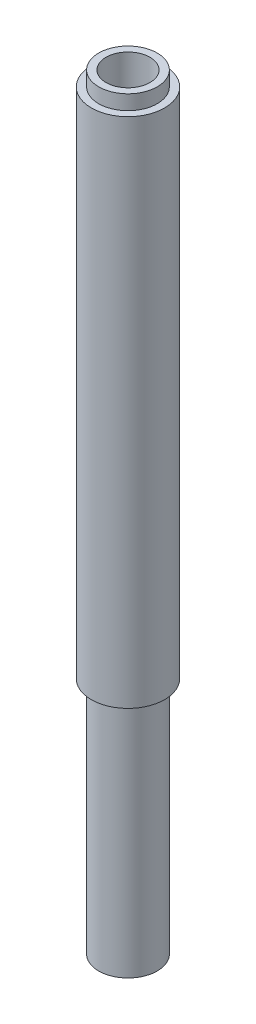
ISO-10303-21;
HEADER;
FILE_DESCRIPTION(('STEP AP214'),'2;1');
FILE_NAME('part.step','',(''),(''),'','','');
FILE_SCHEMA(('AUTOMOTIVE_DESIGN { 1 0 10303 214 1 1 1 1 }'));
ENDSEC;
DATA;
#1=APPLICATION_CONTEXT('core data for automotive mechanical design processes');
#2=APPLICATION_PROTOCOL_DEFINITION('international standard','automotive_design',2000,#1);
#3=PRODUCT_CONTEXT('',#1,'mechanical');
#4=PRODUCT('Part','Part','',(#3));
#5=PRODUCT_RELATED_PRODUCT_CATEGORY('part','',(#4));
#6=PRODUCT_DEFINITION_FORMATION('','',#4);
#7=PRODUCT_DEFINITION_CONTEXT('part definition',#1,'design');
#8=PRODUCT_DEFINITION('design','',#6,#7);
#9=PRODUCT_DEFINITION_SHAPE('','',#8);
#10=(LENGTH_UNIT() NAMED_UNIT(*) SI_UNIT(.MILLI.,.METRE.));
#11=(NAMED_UNIT(*) PLANE_ANGLE_UNIT() SI_UNIT($,.RADIAN.));
#12=(NAMED_UNIT(*) SI_UNIT($,.STERADIAN.) SOLID_ANGLE_UNIT());
#13=UNCERTAINTY_MEASURE_WITH_UNIT(LENGTH_MEASURE(1.E-05),#10,'distance_accuracy_value','');
#14=(GEOMETRIC_REPRESENTATION_CONTEXT(3) GLOBAL_UNCERTAINTY_ASSIGNED_CONTEXT((#13)) GLOBAL_UNIT_ASSIGNED_CONTEXT((#10,
#11,#12)) REPRESENTATION_CONTEXT('',''));
#15=CARTESIAN_POINT('',(0.,0.,0.));
#16=DIRECTION('',(0.,0.,1.));
#17=DIRECTION('',(1.,0.,0.));
#18=AXIS2_PLACEMENT_3D('',#15,#16,#17);
#19=CARTESIAN_POINT('',(0.,0.,0.));
#20=DIRECTION('',(0.,1.,0.));
#21=DIRECTION('',(0.,0.,1.));
#22=AXIS2_PLACEMENT_3D('',#19,#20,#21);
#23=PLANE('',#22);
#24=CARTESIAN_POINT('',(0.,0.,0.));
#25=DIRECTION('',(0.,1.,0.));
#26=DIRECTION('',(0.,0.,1.));
#27=AXIS2_PLACEMENT_3D('',#24,#25,#26);
#28=CIRCLE('',#27,12.7);
#29=CARTESIAN_POINT('',(0.,0.,12.7));
#30=VERTEX_POINT('',#29);
#31=EDGE_CURVE('E57',#30,#30,#28,.T.);
#32=ORIENTED_EDGE('',*,*,#31,.F.);
#33=EDGE_LOOP('',(#32));
#34=FACE_BOUND('',#33,.T.);
#35=CARTESIAN_POINT('',(0.,0.,0.));
#36=DIRECTION('',(0.,1.,0.));
#37=DIRECTION('',(0.,0.,1.));
#38=AXIS2_PLACEMENT_3D('',#35,#36,#37);
#39=CIRCLE('',#38,10.16);
#40=CARTESIAN_POINT('',(0.,0.,10.16));
#41=VERTEX_POINT('',#40);
#42=EDGE_CURVE('E10',#41,#41,#39,.F.);
#43=ORIENTED_EDGE('',*,*,#42,.F.);
#44=EDGE_LOOP('',(#43));
#45=FACE_BOUND('',#44,.T.);
#46=ADVANCED_FACE('F41',(#34,#45),#23,.F.);
#47=CARTESIAN_POINT('',(0.,177.8,0.));
#48=DIRECTION('',(0.,-1.,0.));
#49=DIRECTION('',(0.,0.,-1.));
#50=AXIS2_PLACEMENT_3D('',#47,#48,#49);
#51=CYLINDRICAL_SURFACE('',#50,12.7);
#52=CARTESIAN_POINT('',(0.,177.8,0.));
#53=DIRECTION('',(0.,1.,0.));
#54=DIRECTION('',(0.,0.,1.));
#55=AXIS2_PLACEMENT_3D('',#52,#53,#54);
#56=CIRCLE('',#55,12.7);
#57=CARTESIAN_POINT('',(0.,177.8,12.7));
#58=VERTEX_POINT('',#57);
#59=EDGE_CURVE('E52',#58,#58,#56,.T.);
#60=ORIENTED_EDGE('',*,*,#59,.F.);
#61=EDGE_LOOP('',(#60));
#62=FACE_BOUND('',#61,.T.);
#63=ORIENTED_EDGE('',*,*,#31,.T.);
#64=EDGE_LOOP('',(#63));
#65=FACE_BOUND('',#64,.T.);
#66=ADVANCED_FACE('F43',(#62,#65),#51,.T.);
#67=CARTESIAN_POINT('',(0.,177.8,0.));
#68=DIRECTION('',(0.,1.,0.));
#69=DIRECTION('',(0.,0.,1.));
#70=AXIS2_PLACEMENT_3D('',#67,#68,#69);
#71=PLANE('',#70);
#72=CARTESIAN_POINT('',(0.,177.8,0.));
#73=DIRECTION('',(0.,1.,0.));
#74=DIRECTION('',(0.,0.,1.));
#75=AXIS2_PLACEMENT_3D('',#72,#73,#74);
#76=CIRCLE('',#75,10.16);
#77=CARTESIAN_POINT('',(0.,177.8,10.16));
#78=VERTEX_POINT('',#77);
#79=EDGE_CURVE('E48',#78,#78,#76,.T.);
#80=ORIENTED_EDGE('',*,*,#79,.F.);
#81=EDGE_LOOP('',(#80));
#82=FACE_BOUND('',#81,.T.);
#83=ORIENTED_EDGE('',*,*,#59,.T.);
#84=EDGE_LOOP('',(#83));
#85=FACE_BOUND('',#84,.T.);
#86=ADVANCED_FACE('F101',(#82,#85),#71,.T.);
#87=CARTESIAN_POINT('',(0.,182.88,0.));
#88=DIRECTION('',(0.,-1.,0.));
#89=DIRECTION('',(0.,0.,-1.));
#90=AXIS2_PLACEMENT_3D('',#87,#88,#89);
#91=CYLINDRICAL_SURFACE('',#90,10.16);
#92=CARTESIAN_POINT('',(0.,182.88,0.));
#93=DIRECTION('',(0.,1.,0.));
#94=DIRECTION('',(0.,0.,1.));
#95=AXIS2_PLACEMENT_3D('',#92,#93,#94);
#96=CIRCLE('',#95,10.16);
#97=CARTESIAN_POINT('',(0.,182.88,10.16));
#98=VERTEX_POINT('',#97);
#99=EDGE_CURVE('E60',#98,#98,#96,.T.);
#100=ORIENTED_EDGE('',*,*,#99,.F.);
#101=EDGE_LOOP('',(#100));
#102=FACE_BOUND('',#101,.T.);
#103=ORIENTED_EDGE('',*,*,#79,.T.);
#104=EDGE_LOOP('',(#103));
#105=FACE_BOUND('',#104,.T.);
#106=ADVANCED_FACE('F107',(#102,#105),#91,.T.);
#107=CARTESIAN_POINT('',(0.,182.88,0.));
#108=DIRECTION('',(0.,1.,0.));
#109=DIRECTION('',(0.,0.,1.));
#110=AXIS2_PLACEMENT_3D('',#107,#108,#109);
#111=PLANE('',#110);
#112=CARTESIAN_POINT('',(0.,182.88,0.));
#113=DIRECTION('',(0.,1.,0.));
#114=DIRECTION('',(0.,0.,1.));
#115=AXIS2_PLACEMENT_3D('',#112,#113,#114);
#116=CIRCLE('',#115,7.62);
#117=CARTESIAN_POINT('',(0.,182.88,7.62));
#118=VERTEX_POINT('',#117);
#119=EDGE_CURVE('E66',#118,#118,#116,.T.);
#120=ORIENTED_EDGE('',*,*,#119,.F.);
#121=EDGE_LOOP('',(#120));
#122=FACE_BOUND('',#121,.T.);
#123=ORIENTED_EDGE('',*,*,#99,.T.);
#124=EDGE_LOOP('',(#123));
#125=FACE_BOUND('',#124,.T.);
#126=ADVANCED_FACE('F93',(#122,#125),#111,.T.);
#127=CARTESIAN_POINT('',(0.,0.,0.));
#128=DIRECTION('',(0.,1.,0.));
#129=DIRECTION('',(0.,0.,1.));
#130=AXIS2_PLACEMENT_3D('',#127,#128,#129);
#131=CYLINDRICAL_SURFACE('',#130,7.62);
#132=ORIENTED_EDGE('',*,*,#119,.T.);
#133=EDGE_LOOP('',(#132));
#134=FACE_BOUND('',#133,.T.);
#135=CARTESIAN_POINT('',(0.,-82.804,0.));
#136=DIRECTION('',(0.,-1.,0.));
#137=DIRECTION('',(0.,0.,-1.));
#138=AXIS2_PLACEMENT_3D('',#135,#136,#137);
#139=CIRCLE('',#138,7.62);
#140=CARTESIAN_POINT('',(0.,-82.804,-7.62));
#141=VERTEX_POINT('',#140);
#142=EDGE_CURVE('E74',#141,#141,#139,.T.);
#143=ORIENTED_EDGE('',*,*,#142,.T.);
#144=EDGE_LOOP('',(#143));
#145=FACE_BOUND('',#144,.T.);
#146=ADVANCED_FACE('F80',(#134,#145),#131,.F.);
#147=CARTESIAN_POINT('',(0.,-82.804,0.));
#148=DIRECTION('',(0.,-1.,0.));
#149=DIRECTION('',(0.,0.,-1.));
#150=AXIS2_PLACEMENT_3D('',#147,#148,#149);
#151=PLANE('',#150);
#152=CARTESIAN_POINT('',(0.,-82.804,0.));
#153=DIRECTION('',(0.,-1.,0.));
#154=DIRECTION('',(0.,0.,-1.));
#155=AXIS2_PLACEMENT_3D('',#152,#153,#154);
#156=CIRCLE('',#155,10.16);
#157=CARTESIAN_POINT('',(0.,-82.804,-10.16));
#158=VERTEX_POINT('',#157);
#159=EDGE_CURVE('E70',#158,#158,#156,.T.);
#160=ORIENTED_EDGE('',*,*,#159,.T.);
#161=EDGE_LOOP('',(#160));
#162=FACE_BOUND('',#161,.T.);
#163=ORIENTED_EDGE('',*,*,#142,.F.);
#164=EDGE_LOOP('',(#163));
#165=FACE_BOUND('',#164,.T.);
#166=ADVANCED_FACE('F82',(#162,#165),#151,.T.);
#167=CARTESIAN_POINT('',(0.,-82.804,0.));
#168=DIRECTION('',(0.,1.,0.));
#169=DIRECTION('',(0.,0.,1.));
#170=AXIS2_PLACEMENT_3D('',#167,#168,#169);
#171=CYLINDRICAL_SURFACE('',#170,10.16);
#172=ORIENTED_EDGE('',*,*,#159,.F.);
#173=EDGE_LOOP('',(#172));
#174=FACE_BOUND('',#173,.T.);
#175=ORIENTED_EDGE('',*,*,#42,.T.);
#176=EDGE_LOOP('',(#175));
#177=FACE_BOUND('',#176,.T.);
#178=ADVANCED_FACE('F84',(#174,#177),#171,.T.);
#179=CLOSED_SHELL('',(#46,#66,#86,#106,#126,#146,#166,#178));
#180=MANIFOLD_SOLID_BREP('B2',#179);
#181=ADVANCED_BREP_SHAPE_REPRESENTATION('',(#18,#180),#14);
#182=SHAPE_DEFINITION_REPRESENTATION(#9,#181);
ENDSEC;
END-ISO-10303-21;
